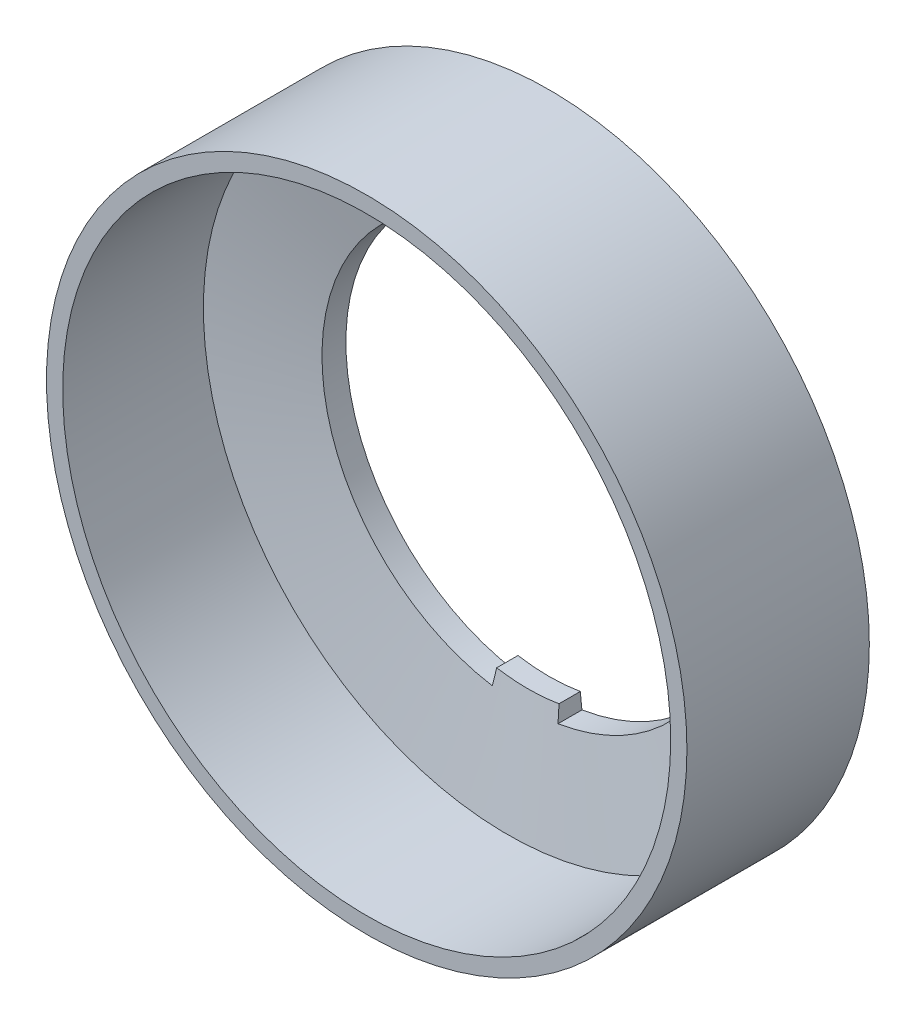
ISO-10303-21;
HEADER;
FILE_DESCRIPTION(('STEP AP214'),'2;1');
FILE_NAME('part.step','',(''),(''),'','','');
FILE_SCHEMA(('AUTOMOTIVE_DESIGN { 1 0 10303 214 1 1 1 1 }'));
ENDSEC;
DATA;
#1=APPLICATION_CONTEXT('core data for automotive mechanical design processes');
#2=APPLICATION_PROTOCOL_DEFINITION('international standard','automotive_design',2000,#1);
#3=PRODUCT_CONTEXT('',#1,'mechanical');
#4=PRODUCT('Part','Part','',(#3));
#5=PRODUCT_RELATED_PRODUCT_CATEGORY('part','',(#4));
#6=PRODUCT_DEFINITION_FORMATION('','',#4);
#7=PRODUCT_DEFINITION_CONTEXT('part definition',#1,'design');
#8=PRODUCT_DEFINITION('design','',#6,#7);
#9=PRODUCT_DEFINITION_SHAPE('','',#8);
#10=(LENGTH_UNIT() NAMED_UNIT(*) SI_UNIT(.MILLI.,.METRE.));
#11=(NAMED_UNIT(*) PLANE_ANGLE_UNIT() SI_UNIT($,.RADIAN.));
#12=(NAMED_UNIT(*) SI_UNIT($,.STERADIAN.) SOLID_ANGLE_UNIT());
#13=UNCERTAINTY_MEASURE_WITH_UNIT(LENGTH_MEASURE(1.E-05),#10,'distance_accuracy_value','');
#14=(GEOMETRIC_REPRESENTATION_CONTEXT(3) GLOBAL_UNCERTAINTY_ASSIGNED_CONTEXT((#13)) GLOBAL_UNIT_ASSIGNED_CONTEXT((#10,
#11,#12)) REPRESENTATION_CONTEXT('',''));
#15=CARTESIAN_POINT('',(0.,0.,0.));
#16=DIRECTION('',(0.,0.,1.));
#17=DIRECTION('',(1.,0.,0.));
#18=AXIS2_PLACEMENT_3D('',#15,#16,#17);
#19=CARTESIAN_POINT('',(0.,0.,275.));
#20=DIRECTION('',(0.,0.,1.));
#21=DIRECTION('',(1.,0.,0.));
#22=AXIS2_PLACEMENT_3D('',#19,#20,#21);
#23=PLANE('',#22);
#24=DIRECTION('',(0.109381398584053,0.993999853945561,0.));
#25=VECTOR('',#24,1.);
#26=CARTESIAN_POINT('',(-2.62217043393671,0.28854799953065,275.));
#27=LINE('',#26,#25);
#28=CARTESIAN_POINT('',(-8.09786252842241,-49.4716234064617,275.));
#29=VERTEX_POINT('',#28);
#30=CARTESIAN_POINT('',(-7.68686170209076,-45.7366669455491,275.));
#31=VERTEX_POINT('',#30);
#32=EDGE_CURVE('E91',#29,#31,#27,.T.);
#33=ORIENTED_EDGE('',*,*,#32,.T.);
#34=CARTESIAN_POINT('',(0.,0.,275.));
#35=DIRECTION('',(0.,0.,1.));
#36=DIRECTION('',(1.,0.,0.));
#37=AXIS2_PLACEMENT_3D('',#34,#35,#36);
#38=CIRCLE('',#37,46.3781257287868);
#39=CARTESIAN_POINT('',(7.68686170209075,-45.7366669455491,275.));
#40=VERTEX_POINT('',#39);
#41=EDGE_CURVE('E85',#40,#31,#38,.F.);
#42=ORIENTED_EDGE('',*,*,#41,.F.);
#43=DIRECTION('',(0.10938139858406,-0.99399985394556,0.));
#44=VECTOR('',#43,1.);
#45=CARTESIAN_POINT('',(2.62217043393637,0.288547999530632,275.));
#46=LINE('',#45,#44);
#47=CARTESIAN_POINT('',(8.09786252842243,-49.4716234064617,275.));
#48=VERTEX_POINT('',#47);
#49=EDGE_CURVE('E89',#40,#48,#46,.T.);
#50=ORIENTED_EDGE('',*,*,#49,.T.);
#51=CARTESIAN_POINT('',(0.,0.,275.));
#52=DIRECTION('',(0.,0.,1.));
#53=DIRECTION('',(1.,0.,0.));
#54=AXIS2_PLACEMENT_3D('',#51,#52,#53);
#55=CIRCLE('',#54,50.13);
#56=EDGE_CURVE('E106',#29,#48,#55,.F.);
#57=ORIENTED_EDGE('',*,*,#56,.F.);
#58=EDGE_LOOP('',(#33,#42,#50,#57));
#59=FACE_BOUND('',#58,.T.);
#60=CARTESIAN_POINT('',(0.,0.,275.));
#61=DIRECTION('',(0.,0.,1.));
#62=DIRECTION('',(1.,0.,0.));
#63=AXIS2_PLACEMENT_3D('',#60,#61,#62);
#64=CIRCLE('',#63,79.);
#65=CARTESIAN_POINT('',(79.,0.,275.));
#66=VERTEX_POINT('',#65);
#67=EDGE_CURVE('E220',#66,#66,#64,.T.);
#68=ORIENTED_EDGE('',*,*,#67,.F.);
#69=EDGE_LOOP('',(#68));
#70=FACE_BOUND('',#69,.T.);
#71=ADVANCED_FACE('F41',(#59,#70),#23,.F.);
#72=CARTESIAN_POINT('',(0.,0.,320.));
#73=DIRECTION('',(0.,0.,1.));
#74=DIRECTION('',(1.,0.,0.));
#75=AXIS2_PLACEMENT_3D('',#72,#73,#74);
#76=PLANE('',#75);
#77=CARTESIAN_POINT('',(0.,0.,320.));
#78=DIRECTION('',(0.,0.,1.));
#79=DIRECTION('',(1.,0.,0.));
#80=AXIS2_PLACEMENT_3D('',#77,#78,#79);
#81=CIRCLE('',#80,75.);
#82=CARTESIAN_POINT('',(75.,0.,320.));
#83=VERTEX_POINT('',#82);
#84=EDGE_CURVE('E112',#83,#83,#81,.T.);
#85=ORIENTED_EDGE('',*,*,#84,.F.);
#86=EDGE_LOOP('',(#85));
#87=FACE_BOUND('',#86,.T.);
#88=CARTESIAN_POINT('',(0.,0.,320.));
#89=DIRECTION('',(0.,0.,1.));
#90=DIRECTION('',(1.,0.,0.));
#91=AXIS2_PLACEMENT_3D('',#88,#89,#90);
#92=CIRCLE('',#91,79.);
#93=CARTESIAN_POINT('',(79.,0.,320.));
#94=VERTEX_POINT('',#93);
#95=EDGE_CURVE('E222',#94,#94,#92,.T.);
#96=ORIENTED_EDGE('',*,*,#95,.T.);
#97=EDGE_LOOP('',(#96));
#98=FACE_BOUND('',#97,.T.);
#99=ADVANCED_FACE('F132',(#87,#98),#76,.T.);
#100=CARTESIAN_POINT('',(2.62217043393637,0.288547999530632,119.046252395518));
#101=DIRECTION('',(0.99399985394556,0.10938139858406,0.));
#102=DIRECTION('',(-0.10938139858406,0.99399985394556,0.));
#103=AXIS2_PLACEMENT_3D('',#100,#101,#102);
#104=PLANE('',#103);
#105=ORIENTED_EDGE('',*,*,#49,.F.);
#106=DIRECTION('',(0.,0.,1.));
#107=VECTOR('',#106,1.);
#108=CARTESIAN_POINT('',(7.68686170209075,-45.7366669455491,119.046252395518));
#109=LINE('',#108,#107);
#110=CARTESIAN_POINT('',(7.68686170209075,-45.7366669455491,280.243000748794));
#111=VERTEX_POINT('',#110);
#112=EDGE_CURVE('E94',#40,#111,#109,.T.);
#113=ORIENTED_EDGE('',*,*,#112,.T.);
#114=CARTESIAN_POINT('',(7.68686170209075,-45.7366669455491,280.243000748794));
#115=CARTESIAN_POINT('',(7.7553620801918,-46.3591618734717,280.353247710479));
#116=CARTESIAN_POINT('',(7.82386233810343,-46.9816557091769,280.463500913176));
#117=CARTESIAN_POINT('',(7.96086261354732,-48.2266411961478,280.684019800589));
#118=CARTESIAN_POINT('',(8.02936263107959,-48.8491328474135,280.794285485306));
#119=CARTESIAN_POINT('',(8.09786252842243,-49.4716234064617,280.904557411034));
#120=B_SPLINE_CURVE_WITH_KNOTS('',3,(#114,#115,#116,#117,#118,#119),.UNSPECIFIED.,.F.,.F.,(4,2,
4),(0.,1.90764767862619,3.81529535723764),.UNSPECIFIED.);
#121=CARTESIAN_POINT('',(8.09786252842243,-49.4716234064617,280.904557411034));
#122=VERTEX_POINT('',#121);
#123=EDGE_CURVE('E120',#111,#122,#120,.T.);
#124=ORIENTED_EDGE('',*,*,#123,.T.);
#125=DIRECTION('',(0.,0.,1.));
#126=VECTOR('',#125,1.);
#127=CARTESIAN_POINT('',(8.09786252842243,-49.4716234064617,119.046252395518));
#128=LINE('',#127,#126);
#129=EDGE_CURVE('E101',#48,#122,#128,.T.);
#130=ORIENTED_EDGE('',*,*,#129,.F.);
#131=EDGE_LOOP('',(#105,#113,#124,#130));
#132=FACE_BOUND('',#131,.T.);
#133=ADVANCED_FACE('F104',(#132),#104,.T.);
#134=CARTESIAN_POINT('',(0.,0.,119.046252395518));
#135=DIRECTION('',(0.,0.,1.));
#136=DIRECTION('',(1.,0.,0.));
#137=AXIS2_PLACEMENT_3D('',#134,#135,#136);
#138=CYLINDRICAL_SURFACE('',#137,46.3781257287868);
#139=ORIENTED_EDGE('',*,*,#112,.F.);
#140=ORIENTED_EDGE('',*,*,#41,.T.);
#141=DIRECTION('',(0.,0.,1.));
#142=VECTOR('',#141,1.);
#143=CARTESIAN_POINT('',(-7.68686170209076,-45.7366669455491,119.046252395518));
#144=LINE('',#143,#142);
#145=CARTESIAN_POINT('',(-7.68686170209076,-45.7366669455491,280.243000748794));
#146=VERTEX_POINT('',#145);
#147=EDGE_CURVE('E56',#31,#146,#144,.T.);
#148=ORIENTED_EDGE('',*,*,#147,.T.);
#149=CARTESIAN_POINT('',(0.,0.,280.243000748794));
#150=DIRECTION('',(0.,0.,1.));
#151=DIRECTION('',(1.,0.,0.));
#152=AXIS2_PLACEMENT_3D('',#149,#150,#151);
#153=CIRCLE('',#152,46.3781257287868);
#154=CARTESIAN_POINT('',(0.,-46.3781257287868,280.243000748794));
#155=VERTEX_POINT('',#154);
#156=EDGE_CURVE('E11',#146,#155,#153,.T.);
#157=ORIENTED_EDGE('',*,*,#156,.T.);
#158=CARTESIAN_POINT('',(0.,0.,280.243000748794));
#159=DIRECTION('',(0.,0.,1.));
#160=DIRECTION('',(1.,0.,0.));
#161=AXIS2_PLACEMENT_3D('',#158,#159,#160);
#162=CIRCLE('',#161,46.3781257287868);
#163=EDGE_CURVE('E97',#155,#111,#162,.T.);
#164=ORIENTED_EDGE('',*,*,#163,.T.);
#165=EDGE_LOOP('',(#139,#140,#148,#157,#164));
#166=FACE_BOUND('',#165,.T.);
#167=ADVANCED_FACE('F95',(#166),#138,.F.);
#168=CARTESIAN_POINT('',(-2.62217043393671,0.28854799953065,119.046252395518));
#169=DIRECTION('',(-0.993999853945561,0.109381398584053,0.));
#170=DIRECTION('',(-0.109381398584053,-0.993999853945561,0.));
#171=AXIS2_PLACEMENT_3D('',#168,#169,#170);
#172=PLANE('',#171);
#173=ORIENTED_EDGE('',*,*,#32,.F.);
#174=DIRECTION('',(0.,0.,1.));
#175=VECTOR('',#174,1.);
#176=CARTESIAN_POINT('',(-8.09786252842241,-49.4716234064617,119.046252395518));
#177=LINE('',#176,#175);
#178=CARTESIAN_POINT('',(-8.09786252842241,-49.4716234064617,280.904557411034));
#179=VERTEX_POINT('',#178);
#180=EDGE_CURVE('E63',#29,#179,#177,.T.);
#181=ORIENTED_EDGE('',*,*,#180,.T.);
#182=CARTESIAN_POINT('',(-8.09786252842241,-49.4716234064617,280.904557411034));
#183=CARTESIAN_POINT('',(-8.02936263107957,-48.8491328474135,280.794285485306));
#184=CARTESIAN_POINT('',(-7.96086261354731,-48.2266411961478,280.684019800589));
#185=CARTESIAN_POINT('',(-7.82386233810343,-46.9816557091769,280.463500913176));
#186=CARTESIAN_POINT('',(-7.7553620801918,-46.3591618734717,280.353247710479));
#187=CARTESIAN_POINT('',(-7.68686170209076,-45.7366669455491,280.243000748794));
#188=B_SPLINE_CURVE_WITH_KNOTS('',3,(#182,#183,#184,#185,#186,#187),.UNSPECIFIED.,.F.,.F.,(4,2,
4),(0.,1.90764767861146,3.81529535723765),.UNSPECIFIED.);
#189=EDGE_CURVE('E50',#179,#146,#188,.T.);
#190=ORIENTED_EDGE('',*,*,#189,.T.);
#191=ORIENTED_EDGE('',*,*,#147,.F.);
#192=EDGE_LOOP('',(#173,#181,#190,#191));
#193=FACE_BOUND('',#192,.T.);
#194=ADVANCED_FACE('F138',(#193),#172,.T.);
#195=CARTESIAN_POINT('',(0.,0.,119.046252395518));
#196=DIRECTION('',(0.,0.,1.));
#197=DIRECTION('',(1.,0.,0.));
#198=AXIS2_PLACEMENT_3D('',#195,#196,#197);
#199=CYLINDRICAL_SURFACE('',#198,50.13);
#200=ORIENTED_EDGE('',*,*,#180,.F.);
#201=ORIENTED_EDGE('',*,*,#56,.T.);
#202=ORIENTED_EDGE('',*,*,#129,.T.);
#203=CARTESIAN_POINT('',(0.,0.,280.904557411034));
#204=DIRECTION('',(0.,0.,1.));
#205=DIRECTION('',(1.,0.,0.));
#206=AXIS2_PLACEMENT_3D('',#203,#204,#205);
#207=CIRCLE('',#206,50.13);
#208=EDGE_CURVE('E127',#122,#179,#207,.T.);
#209=ORIENTED_EDGE('',*,*,#208,.T.);
#210=EDGE_LOOP('',(#200,#201,#202,#209));
#211=FACE_BOUND('',#210,.T.);
#212=ADVANCED_FACE('F134',(#211),#199,.F.);
#213=CARTESIAN_POINT('',(0.,0.,546.924708218387));
#214=DIRECTION('',(0.,0.,-1.));
#215=DIRECTION('',(-1.,0.,0.));
#216=AXIS2_PLACEMENT_3D('',#213,#214,#215);
#217=CYLINDRICAL_SURFACE('',#216,75.);
#218=CARTESIAN_POINT('',(0.,0.,285.289809421254));
#219=DIRECTION('',(0.,0.,1.));
#220=DIRECTION('',(1.,0.,0.));
#221=AXIS2_PLACEMENT_3D('',#218,#219,#220);
#222=CIRCLE('',#221,75.);
#223=CARTESIAN_POINT('',(75.,0.,285.289809421254));
#224=VERTEX_POINT('',#223);
#225=EDGE_CURVE('E105',#224,#224,#222,.F.);
#226=ORIENTED_EDGE('',*,*,#225,.T.);
#227=EDGE_LOOP('',(#226));
#228=FACE_BOUND('',#227,.T.);
#229=ORIENTED_EDGE('',*,*,#84,.T.);
#230=EDGE_LOOP('',(#229));
#231=FACE_BOUND('',#230,.T.);
#232=ADVANCED_FACE('F137',(#228,#231),#217,.F.);
#233=CARTESIAN_POINT('',(0.,0.,275.));
#234=DIRECTION('',(0.,0.,1.));
#235=DIRECTION('',(1.,0.,0.));
#236=AXIS2_PLACEMENT_3D('',#233,#234,#235);
#237=CYLINDRICAL_SURFACE('',#236,79.);
#238=CARTESIAN_POINT('',(79.,0.,275.));
#239=CARTESIAN_POINT('',(79.,0.,275.46875));
#240=CARTESIAN_POINT('',(79.,0.,275.9375));
#241=CARTESIAN_POINT('',(79.,0.,276.875));
#242=CARTESIAN_POINT('',(79.,0.,277.34375));
#243=CARTESIAN_POINT('',(79.,0.,278.28125));
#244=CARTESIAN_POINT('',(79.,0.,278.75));
#245=CARTESIAN_POINT('',(79.,0.,279.6875));
#246=CARTESIAN_POINT('',(79.,0.,280.15625));
#247=CARTESIAN_POINT('',(79.,0.,281.09375));
#248=CARTESIAN_POINT('',(79.,0.,281.5625));
#249=CARTESIAN_POINT('',(79.,0.,282.5));
#250=CARTESIAN_POINT('',(79.,0.,282.96875));
#251=CARTESIAN_POINT('',(79.,0.,283.90625));
#252=CARTESIAN_POINT('',(79.,0.,284.375));
#253=CARTESIAN_POINT('',(79.,0.,285.3125));
#254=CARTESIAN_POINT('',(79.,0.,285.78125));
#255=CARTESIAN_POINT('',(79.,0.,286.71875));
#256=CARTESIAN_POINT('',(79.,0.,287.1875));
#257=CARTESIAN_POINT('',(79.,0.,288.125));
#258=CARTESIAN_POINT('',(79.,0.,288.59375));
#259=CARTESIAN_POINT('',(79.,0.,289.53125));
#260=CARTESIAN_POINT('',(79.,0.,290.));
#261=CARTESIAN_POINT('',(79.,0.,290.9375));
#262=CARTESIAN_POINT('',(79.,0.,291.40625));
#263=CARTESIAN_POINT('',(79.,0.,292.34375));
#264=CARTESIAN_POINT('',(79.,0.,292.8125));
#265=CARTESIAN_POINT('',(79.,0.,293.75));
#266=CARTESIAN_POINT('',(79.,0.,294.21875));
#267=CARTESIAN_POINT('',(79.,0.,295.15625));
#268=CARTESIAN_POINT('',(79.,0.,295.625));
#269=CARTESIAN_POINT('',(79.,0.,296.5625));
#270=CARTESIAN_POINT('',(79.,0.,297.03125));
#271=CARTESIAN_POINT('',(79.,0.,297.96875));
#272=CARTESIAN_POINT('',(79.,0.,298.4375));
#273=CARTESIAN_POINT('',(79.,0.,299.375));
#274=CARTESIAN_POINT('',(79.,0.,299.84375));
#275=CARTESIAN_POINT('',(79.,0.,300.78125));
#276=CARTESIAN_POINT('',(79.,0.,301.25));
#277=CARTESIAN_POINT('',(79.,0.,302.1875));
#278=CARTESIAN_POINT('',(79.,0.,302.65625));
#279=CARTESIAN_POINT('',(79.,0.,303.59375));
#280=CARTESIAN_POINT('',(79.,0.,304.0625));
#281=CARTESIAN_POINT('',(79.,0.,305.));
#282=CARTESIAN_POINT('',(79.,0.,305.46875));
#283=CARTESIAN_POINT('',(79.,0.,306.40625));
#284=CARTESIAN_POINT('',(79.,0.,306.875));
#285=CARTESIAN_POINT('',(79.,0.,307.8125));
#286=CARTESIAN_POINT('',(79.,0.,308.28125));
#287=CARTESIAN_POINT('',(79.,0.,309.21875));
#288=CARTESIAN_POINT('',(79.,0.,309.6875));
#289=CARTESIAN_POINT('',(79.,0.,310.625));
#290=CARTESIAN_POINT('',(79.,0.,311.09375));
#291=CARTESIAN_POINT('',(79.,0.,312.03125));
#292=CARTESIAN_POINT('',(79.,0.,312.5));
#293=CARTESIAN_POINT('',(79.,0.,313.4375));
#294=CARTESIAN_POINT('',(79.,0.,313.90625));
#295=CARTESIAN_POINT('',(79.,0.,314.84375));
#296=CARTESIAN_POINT('',(79.,0.,315.3125));
#297=CARTESIAN_POINT('',(79.,0.,316.25));
#298=CARTESIAN_POINT('',(79.,0.,316.71875));
#299=CARTESIAN_POINT('',(79.,0.,317.65625));
#300=CARTESIAN_POINT('',(79.,0.,318.125));
#301=CARTESIAN_POINT('',(79.,0.,319.0625));
#302=CARTESIAN_POINT('',(79.,0.,319.53125));
#303=CARTESIAN_POINT('',(79.,0.,320.));
#304=B_SPLINE_CURVE_WITH_KNOTS('',3,(#238,#239,#240,#241,#242,#243,#244,#245,#246,#247,#248,
#249,#250,#251,#252,#253,#254,#255,#256,#257,#258,#259,#260,#261,#262,#263,#264,#265,#266,#267,
#268,#269,#270,#271,#272,#273,#274,#275,#276,#277,#278,#279,#280,#281,#282,#283,#284,#285,#286,
#287,#288,#289,#290,#291,#292,#293,#294,#295,#296,#297,#298,#299,#300,#301,#302,#303),
.UNSPECIFIED.,.F.,.F.,(4,2,2,2,2,2,2,2,2,2,2,2,2,2,2,2,2,2,2,2,2,2,2,2,2,2,2,2,2,2,2,2,4),(0.,
1.40625000000005,2.81250000000005,4.21875000000005,5.62500000000005,7.03125000000004,
8.43750000000004,9.84375000000004,11.25,12.65625,14.0625,15.46875,16.875,18.28125,19.6875,
21.09375,22.5,23.90625,25.3125,26.71875,28.125,29.53125,30.9375,32.34375,33.75,35.15625,36.5625,
37.96875,39.375,40.78125,42.1875,43.59375,45.),.UNSPECIFIED.);
#305=EDGE_CURVE('BSEAM174',#66,#94,#304,.T.);
#306=ORIENTED_EDGE('',*,*,#67,.T.);
#307=ORIENTED_EDGE('',*,*,#95,.F.);
#308=ORIENTED_EDGE('',*,*,#305,.T.);
#309=ORIENTED_EDGE('',*,*,#305,.F.);
#310=EDGE_LOOP('',(#306,#308,#307,#309));
#311=FACE_BOUND('',#310,.T.);
#312=ADVANCED_FACE('F174',(#311),#237,.T.);
#313=CARTESIAN_POINT('',(0.,0.,285.289809421254));
#314=DIRECTION('',(0.,0.,1.));
#315=DIRECTION('',(1.,0.,0.));
#316=AXIS2_PLACEMENT_3D('',#313,#314,#315);
#317=CONICAL_SURFACE('',#316,75.,1.39626340159546);
#318=ORIENTED_EDGE('',*,*,#123,.F.);
#319=ORIENTED_EDGE('',*,*,#163,.F.);
#320=ORIENTED_EDGE('',*,*,#156,.F.);
#321=ORIENTED_EDGE('',*,*,#189,.F.);
#322=ORIENTED_EDGE('',*,*,#208,.F.);
#323=EDGE_LOOP('',(#318,#319,#320,#321,#322));
#324=FACE_BOUND('',#323,.T.);
#325=ORIENTED_EDGE('',*,*,#225,.F.);
#326=EDGE_LOOP('',(#325));
#327=FACE_BOUND('',#326,.T.);
#328=ADVANCED_FACE('F43',(#324,#327),#317,.F.);
#329=CLOSED_SHELL('',(#71,#99,#133,#167,#194,#212,#232,#312,#328));
#330=MANIFOLD_SOLID_BREP('B2',#329);
#331=ADVANCED_BREP_SHAPE_REPRESENTATION('',(#18,#330),#14);
#332=SHAPE_DEFINITION_REPRESENTATION(#9,#331);
ENDSEC;
END-ISO-10303-21;
